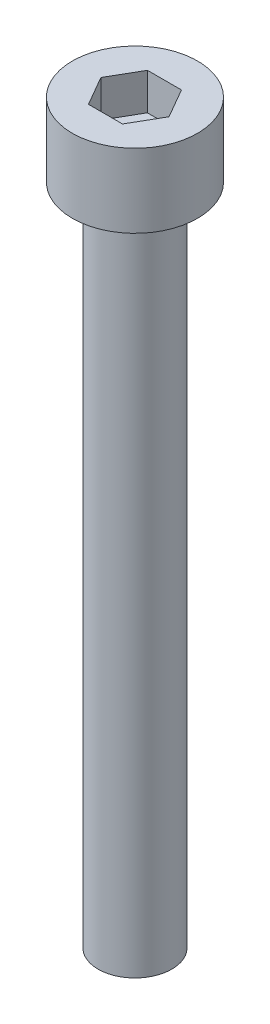
ISO-10303-21;
HEADER;
FILE_DESCRIPTION(('STEP AP214'),'2;1');
FILE_NAME('part.step','',(''),(''),'','','');
FILE_SCHEMA(('AUTOMOTIVE_DESIGN { 1 0 10303 214 1 1 1 1 }'));
ENDSEC;
DATA;
#1=APPLICATION_CONTEXT('core data for automotive mechanical design processes');
#2=APPLICATION_PROTOCOL_DEFINITION('international standard','automotive_design',2000,#1);
#3=PRODUCT_CONTEXT('',#1,'mechanical');
#4=PRODUCT('Part','Part','',(#3));
#5=PRODUCT_RELATED_PRODUCT_CATEGORY('part','',(#4));
#6=PRODUCT_DEFINITION_FORMATION('','',#4);
#7=PRODUCT_DEFINITION_CONTEXT('part definition',#1,'design');
#8=PRODUCT_DEFINITION('design','',#6,#7);
#9=PRODUCT_DEFINITION_SHAPE('','',#8);
#10=(LENGTH_UNIT() NAMED_UNIT(*) SI_UNIT(.MILLI.,.METRE.));
#11=(NAMED_UNIT(*) PLANE_ANGLE_UNIT() SI_UNIT($,.RADIAN.));
#12=(NAMED_UNIT(*) SI_UNIT($,.STERADIAN.) SOLID_ANGLE_UNIT());
#13=UNCERTAINTY_MEASURE_WITH_UNIT(LENGTH_MEASURE(1.E-05),#10,'distance_accuracy_value','');
#14=(GEOMETRIC_REPRESENTATION_CONTEXT(3) GLOBAL_UNCERTAINTY_ASSIGNED_CONTEXT((#13)) GLOBAL_UNIT_ASSIGNED_CONTEXT((#10,
#11,#12)) REPRESENTATION_CONTEXT('',''));
#15=CARTESIAN_POINT('',(0.,0.,0.));
#16=DIRECTION('',(0.,0.,1.));
#17=DIRECTION('',(1.,0.,0.));
#18=AXIS2_PLACEMENT_3D('',#15,#16,#17);
#19=CARTESIAN_POINT('',(4.25000000000001,5.,0.));
#20=DIRECTION('',(0.,-1.,0.));
#21=DIRECTION('',(0.,0.,-1.));
#22=AXIS2_PLACEMENT_3D('',#19,#20,#21);
#23=PLANE('',#22);
#24=DIRECTION('',(-1.,0.,0.));
#25=VECTOR('',#24,1.);
#26=CARTESIAN_POINT('',(1.15470053837925,5.,-2.));
#27=LINE('',#26,#25);
#28=CARTESIAN_POINT('',(1.15470053837925,5.,-2.));
#29=VERTEX_POINT('',#28);
#30=CARTESIAN_POINT('',(-1.15470053837925,5.,-2.));
#31=VERTEX_POINT('',#30);
#32=EDGE_CURVE('E124',#29,#31,#27,.T.);
#33=ORIENTED_EDGE('',*,*,#32,.F.);
#34=DIRECTION('',(-0.5,0.,-0.866025403784439));
#35=VECTOR('',#34,1.);
#36=CARTESIAN_POINT('',(2.3094010767585,5.,0.));
#37=LINE('',#36,#35);
#38=CARTESIAN_POINT('',(2.3094010767585,5.,0.));
#39=VERTEX_POINT('',#38);
#40=EDGE_CURVE('E50',#39,#29,#37,.T.);
#41=ORIENTED_EDGE('',*,*,#40,.F.);
#42=DIRECTION('',(0.5,0.,-0.866025403784439));
#43=VECTOR('',#42,1.);
#44=CARTESIAN_POINT('',(1.15470053837925,5.,2.));
#45=LINE('',#44,#43);
#46=CARTESIAN_POINT('',(1.15470053837925,5.,2.));
#47=VERTEX_POINT('',#46);
#48=EDGE_CURVE('E133',#47,#39,#45,.T.);
#49=ORIENTED_EDGE('',*,*,#48,.F.);
#50=DIRECTION('',(1.,0.,0.));
#51=VECTOR('',#50,1.);
#52=CARTESIAN_POINT('',(-1.15470053837925,5.,2.));
#53=LINE('',#52,#51);
#54=CARTESIAN_POINT('',(-1.15470053837925,5.,2.));
#55=VERTEX_POINT('',#54);
#56=EDGE_CURVE('E131',#55,#47,#53,.T.);
#57=ORIENTED_EDGE('',*,*,#56,.F.);
#58=DIRECTION('',(0.5,0.,0.866025403784438));
#59=VECTOR('',#58,1.);
#60=CARTESIAN_POINT('',(-2.3094010767585,5.,0.));
#61=LINE('',#60,#59);
#62=CARTESIAN_POINT('',(-2.3094010767585,5.,0.));
#63=VERTEX_POINT('',#62);
#64=EDGE_CURVE('E98',#63,#55,#61,.T.);
#65=ORIENTED_EDGE('',*,*,#64,.F.);
#66=DIRECTION('',(-0.5,0.,0.866025403784439));
#67=VECTOR('',#66,1.);
#68=CARTESIAN_POINT('',(-1.15470053837925,5.,-2.));
#69=LINE('',#68,#67);
#70=EDGE_CURVE('E127',#31,#63,#69,.T.);
#71=ORIENTED_EDGE('',*,*,#70,.F.);
#72=EDGE_LOOP('',(#33,#41,#49,#57,#65,#71));
#73=FACE_BOUND('',#72,.T.);
#74=CARTESIAN_POINT('',(0.,5.,0.));
#75=DIRECTION('',(0.,1.,0.));
#76=DIRECTION('',(0.,0.,1.));
#77=AXIS2_PLACEMENT_3D('',#74,#75,#76);
#78=CIRCLE('',#77,4.25000000000001);
#79=CARTESIAN_POINT('',(0.,5.,4.25000000000001));
#80=VERTEX_POINT('',#79);
#81=EDGE_CURVE('E11',#80,#80,#78,.T.);
#82=ORIENTED_EDGE('',*,*,#81,.T.);
#83=EDGE_LOOP('',(#82));
#84=FACE_BOUND('',#83,.T.);
#85=ADVANCED_FACE('F36',(#73,#84),#23,.F.);
#86=CARTESIAN_POINT('',(0.,61.6916426261037,0.));
#87=DIRECTION('',(0.,1.,0.));
#88=DIRECTION('',(0.,0.,1.));
#89=AXIS2_PLACEMENT_3D('',#86,#87,#88);
#90=CYLINDRICAL_SURFACE('',#89,4.25000000000001);
#91=ORIENTED_EDGE('',*,*,#81,.F.);
#92=EDGE_LOOP('',(#91));
#93=FACE_BOUND('',#92,.T.);
#94=CARTESIAN_POINT('',(0.,0.,0.));
#95=DIRECTION('',(0.,1.,0.));
#96=DIRECTION('',(0.,0.,1.));
#97=AXIS2_PLACEMENT_3D('',#94,#95,#96);
#98=CIRCLE('',#97,4.25000000000001);
#99=CARTESIAN_POINT('',(0.,0.,4.25000000000001));
#100=VERTEX_POINT('',#99);
#101=EDGE_CURVE('E43',#100,#100,#98,.T.);
#102=ORIENTED_EDGE('',*,*,#101,.T.);
#103=EDGE_LOOP('',(#102));
#104=FACE_BOUND('',#103,.T.);
#105=ADVANCED_FACE('F150',(#93,#104),#90,.T.);
#106=CARTESIAN_POINT('',(2.50000000000001,0.,0.));
#107=DIRECTION('',(0.,1.,0.));
#108=DIRECTION('',(0.,0.,1.));
#109=AXIS2_PLACEMENT_3D('',#106,#107,#108);
#110=PLANE('',#109);
#111=ORIENTED_EDGE('',*,*,#101,.F.);
#112=EDGE_LOOP('',(#111));
#113=FACE_BOUND('',#112,.T.);
#114=CARTESIAN_POINT('',(0.,0.,0.));
#115=DIRECTION('',(0.,1.,0.));
#116=DIRECTION('',(0.,0.,1.));
#117=AXIS2_PLACEMENT_3D('',#114,#115,#116);
#118=CIRCLE('',#117,2.50000000000001);
#119=CARTESIAN_POINT('',(0.,0.,2.50000000000001));
#120=VERTEX_POINT('',#119);
#121=EDGE_CURVE('E145',#120,#120,#118,.T.);
#122=ORIENTED_EDGE('',*,*,#121,.T.);
#123=EDGE_LOOP('',(#122));
#124=FACE_BOUND('',#123,.T.);
#125=ADVANCED_FACE('F152',(#113,#124),#110,.F.);
#126=CARTESIAN_POINT('',(0.,61.6916426261037,0.));
#127=DIRECTION('',(0.,1.,0.));
#128=DIRECTION('',(0.,0.,1.));
#129=AXIS2_PLACEMENT_3D('',#126,#127,#128);
#130=CYLINDRICAL_SURFACE('',#129,2.50000000000001);
#131=ORIENTED_EDGE('',*,*,#121,.F.);
#132=EDGE_LOOP('',(#131));
#133=FACE_BOUND('',#132,.T.);
#134=CARTESIAN_POINT('',(0.,-45.,0.));
#135=DIRECTION('',(0.,1.,0.));
#136=DIRECTION('',(0.,0.,1.));
#137=AXIS2_PLACEMENT_3D('',#134,#135,#136);
#138=CIRCLE('',#137,2.50000000000001);
#139=CARTESIAN_POINT('',(0.,-45.,2.50000000000001));
#140=VERTEX_POINT('',#139);
#141=EDGE_CURVE('E137',#140,#140,#138,.T.);
#142=ORIENTED_EDGE('',*,*,#141,.T.);
#143=EDGE_LOOP('',(#142));
#144=FACE_BOUND('',#143,.T.);
#145=ADVANCED_FACE('F155',(#133,#144),#130,.T.);
#146=CARTESIAN_POINT('',(0.,-45.,0.));
#147=DIRECTION('',(0.,1.,0.));
#148=DIRECTION('',(0.,0.,1.));
#149=AXIS2_PLACEMENT_3D('',#146,#147,#148);
#150=PLANE('',#149);
#151=ORIENTED_EDGE('',*,*,#141,.F.);
#152=EDGE_LOOP('',(#151));
#153=FACE_BOUND('',#152,.T.);
#154=ADVANCED_FACE('F161',(#153),#150,.F.);
#155=CARTESIAN_POINT('',(2.3094010767585,2.5,0.));
#156=DIRECTION('',(0.866025403784439,0.,-0.5));
#157=DIRECTION('',(-0.5,0.,-0.866025403784439));
#158=AXIS2_PLACEMENT_3D('',#155,#156,#157);
#159=PLANE('',#158);
#160=ORIENTED_EDGE('',*,*,#40,.T.);
#161=DIRECTION('',(0.,1.,0.));
#162=VECTOR('',#161,1.);
#163=CARTESIAN_POINT('',(1.15470053837925,2.5,-2.));
#164=LINE('',#163,#162);
#165=CARTESIAN_POINT('',(1.15470053837925,2.5,-2.));
#166=VERTEX_POINT('',#165);
#167=EDGE_CURVE('E80',#166,#29,#164,.T.);
#168=ORIENTED_EDGE('',*,*,#167,.F.);
#169=DIRECTION('',(-0.5,0.,-0.866025403784439));
#170=VECTOR('',#169,1.);
#171=CARTESIAN_POINT('',(2.3094010767585,2.5,0.));
#172=LINE('',#171,#170);
#173=CARTESIAN_POINT('',(2.3094010767585,2.5,0.));
#174=VERTEX_POINT('',#173);
#175=EDGE_CURVE('E135',#174,#166,#172,.T.);
#176=ORIENTED_EDGE('',*,*,#175,.F.);
#177=DIRECTION('',(0.,1.,0.));
#178=VECTOR('',#177,1.);
#179=CARTESIAN_POINT('',(2.3094010767585,2.5,0.));
#180=LINE('',#179,#178);
#181=EDGE_CURVE('E58',#174,#39,#180,.T.);
#182=ORIENTED_EDGE('',*,*,#181,.T.);
#183=EDGE_LOOP('',(#160,#168,#176,#182));
#184=FACE_BOUND('',#183,.T.);
#185=ADVANCED_FACE('F166',(#184),#159,.F.);
#186=CARTESIAN_POINT('',(1.15470053837925,2.5,2.));
#187=DIRECTION('',(0.866025403784439,0.,0.5));
#188=DIRECTION('',(0.5,0.,-0.866025403784439));
#189=AXIS2_PLACEMENT_3D('',#186,#187,#188);
#190=PLANE('',#189);
#191=ORIENTED_EDGE('',*,*,#48,.T.);
#192=ORIENTED_EDGE('',*,*,#181,.F.);
#193=DIRECTION('',(0.5,0.,-0.866025403784439));
#194=VECTOR('',#193,1.);
#195=CARTESIAN_POINT('',(1.15470053837925,2.5,2.));
#196=LINE('',#195,#194);
#197=CARTESIAN_POINT('',(1.15470053837925,2.5,2.));
#198=VERTEX_POINT('',#197);
#199=EDGE_CURVE('E110',#198,#174,#196,.T.);
#200=ORIENTED_EDGE('',*,*,#199,.F.);
#201=DIRECTION('',(0.,1.,0.));
#202=VECTOR('',#201,1.);
#203=CARTESIAN_POINT('',(1.15470053837925,2.5,2.));
#204=LINE('',#203,#202);
#205=EDGE_CURVE('E102',#198,#47,#204,.T.);
#206=ORIENTED_EDGE('',*,*,#205,.T.);
#207=EDGE_LOOP('',(#191,#192,#200,#206));
#208=FACE_BOUND('',#207,.T.);
#209=ADVANCED_FACE('F171',(#208),#190,.F.);
#210=CARTESIAN_POINT('',(-1.15470053837925,2.5,2.));
#211=DIRECTION('',(0.,0.,1.));
#212=DIRECTION('',(1.,0.,0.));
#213=AXIS2_PLACEMENT_3D('',#210,#211,#212);
#214=PLANE('',#213);
#215=ORIENTED_EDGE('',*,*,#56,.T.);
#216=ORIENTED_EDGE('',*,*,#205,.F.);
#217=DIRECTION('',(1.,0.,0.));
#218=VECTOR('',#217,1.);
#219=CARTESIAN_POINT('',(-1.15470053837925,2.5,2.));
#220=LINE('',#219,#218);
#221=CARTESIAN_POINT('',(-1.15470053837925,2.5,2.));
#222=VERTEX_POINT('',#221);
#223=EDGE_CURVE('E106',#222,#198,#220,.T.);
#224=ORIENTED_EDGE('',*,*,#223,.F.);
#225=DIRECTION('',(0.,1.,0.));
#226=VECTOR('',#225,1.);
#227=CARTESIAN_POINT('',(-1.15470053837925,2.5,2.));
#228=LINE('',#227,#226);
#229=EDGE_CURVE('E91',#222,#55,#228,.T.);
#230=ORIENTED_EDGE('',*,*,#229,.T.);
#231=EDGE_LOOP('',(#215,#216,#224,#230));
#232=FACE_BOUND('',#231,.T.);
#233=ADVANCED_FACE('F107',(#232),#214,.F.);
#234=CARTESIAN_POINT('',(-2.3094010767585,2.5,0.));
#235=DIRECTION('',(-0.866025403784438,0.,0.5));
#236=DIRECTION('',(0.5,0.,0.866025403784439));
#237=AXIS2_PLACEMENT_3D('',#234,#235,#236);
#238=PLANE('',#237);
#239=ORIENTED_EDGE('',*,*,#64,.T.);
#240=ORIENTED_EDGE('',*,*,#229,.F.);
#241=DIRECTION('',(0.5,0.,0.866025403784438));
#242=VECTOR('',#241,1.);
#243=CARTESIAN_POINT('',(-2.3094010767585,2.5,0.));
#244=LINE('',#243,#242);
#245=CARTESIAN_POINT('',(-2.3094010767585,2.5,0.));
#246=VERTEX_POINT('',#245);
#247=EDGE_CURVE('E95',#246,#222,#244,.T.);
#248=ORIENTED_EDGE('',*,*,#247,.F.);
#249=DIRECTION('',(0.,1.,0.));
#250=VECTOR('',#249,1.);
#251=CARTESIAN_POINT('',(-2.3094010767585,2.5,0.));
#252=LINE('',#251,#250);
#253=EDGE_CURVE('E103',#246,#63,#252,.T.);
#254=ORIENTED_EDGE('',*,*,#253,.T.);
#255=EDGE_LOOP('',(#239,#240,#248,#254));
#256=FACE_BOUND('',#255,.T.);
#257=ADVANCED_FACE('F93',(#256),#238,.F.);
#258=CARTESIAN_POINT('',(-1.15470053837925,2.5,-2.));
#259=DIRECTION('',(-0.866025403784439,0.,-0.5));
#260=DIRECTION('',(-0.5,0.,0.866025403784439));
#261=AXIS2_PLACEMENT_3D('',#258,#259,#260);
#262=PLANE('',#261);
#263=ORIENTED_EDGE('',*,*,#70,.T.);
#264=ORIENTED_EDGE('',*,*,#253,.F.);
#265=DIRECTION('',(-0.5,0.,0.866025403784439));
#266=VECTOR('',#265,1.);
#267=CARTESIAN_POINT('',(-1.15470053837925,2.5,-2.));
#268=LINE('',#267,#266);
#269=CARTESIAN_POINT('',(-1.15470053837925,2.5,-2.));
#270=VERTEX_POINT('',#269);
#271=EDGE_CURVE('E116',#270,#246,#268,.T.);
#272=ORIENTED_EDGE('',*,*,#271,.F.);
#273=DIRECTION('',(0.,1.,0.));
#274=VECTOR('',#273,1.);
#275=CARTESIAN_POINT('',(-1.15470053837925,2.5,-2.));
#276=LINE('',#275,#274);
#277=EDGE_CURVE('E140',#270,#31,#276,.T.);
#278=ORIENTED_EDGE('',*,*,#277,.T.);
#279=EDGE_LOOP('',(#263,#264,#272,#278));
#280=FACE_BOUND('',#279,.T.);
#281=ADVANCED_FACE('F197',(#280),#262,.F.);
#282=CARTESIAN_POINT('',(1.15470053837925,2.5,-2.));
#283=DIRECTION('',(0.,0.,-1.));
#284=DIRECTION('',(-1.,0.,0.));
#285=AXIS2_PLACEMENT_3D('',#282,#283,#284);
#286=PLANE('',#285);
#287=ORIENTED_EDGE('',*,*,#32,.T.);
#288=ORIENTED_EDGE('',*,*,#277,.F.);
#289=DIRECTION('',(-1.,0.,0.));
#290=VECTOR('',#289,1.);
#291=CARTESIAN_POINT('',(1.15470053837925,2.5,-2.));
#292=LINE('',#291,#290);
#293=EDGE_CURVE('E118',#166,#270,#292,.T.);
#294=ORIENTED_EDGE('',*,*,#293,.F.);
#295=ORIENTED_EDGE('',*,*,#167,.T.);
#296=EDGE_LOOP('',(#287,#288,#294,#295));
#297=FACE_BOUND('',#296,.T.);
#298=ADVANCED_FACE('F185',(#297),#286,.F.);
#299=CARTESIAN_POINT('',(3.46410161513775,2.5,2.));
#300=DIRECTION('',(0.,-1.,0.));
#301=DIRECTION('',(0.,0.,-1.));
#302=AXIS2_PLACEMENT_3D('',#299,#300,#301);
#303=PLANE('',#302);
#304=ORIENTED_EDGE('',*,*,#175,.T.);
#305=ORIENTED_EDGE('',*,*,#293,.T.);
#306=ORIENTED_EDGE('',*,*,#271,.T.);
#307=ORIENTED_EDGE('',*,*,#247,.T.);
#308=ORIENTED_EDGE('',*,*,#223,.T.);
#309=ORIENTED_EDGE('',*,*,#199,.T.);
#310=EDGE_LOOP('',(#304,#305,#306,#307,#308,#309));
#311=FACE_BOUND('',#310,.T.);
#312=ADVANCED_FACE('F113',(#311),#303,.F.);
#313=CLOSED_SHELL('',(#85,#105,#125,#145,#154,#185,#209,#233,#257,#281,#298,#312));
#314=MANIFOLD_SOLID_BREP('B2',#313);
#315=ADVANCED_BREP_SHAPE_REPRESENTATION('',(#18,#314),#14);
#316=SHAPE_DEFINITION_REPRESENTATION(#9,#315);
ENDSEC;
END-ISO-10303-21;
